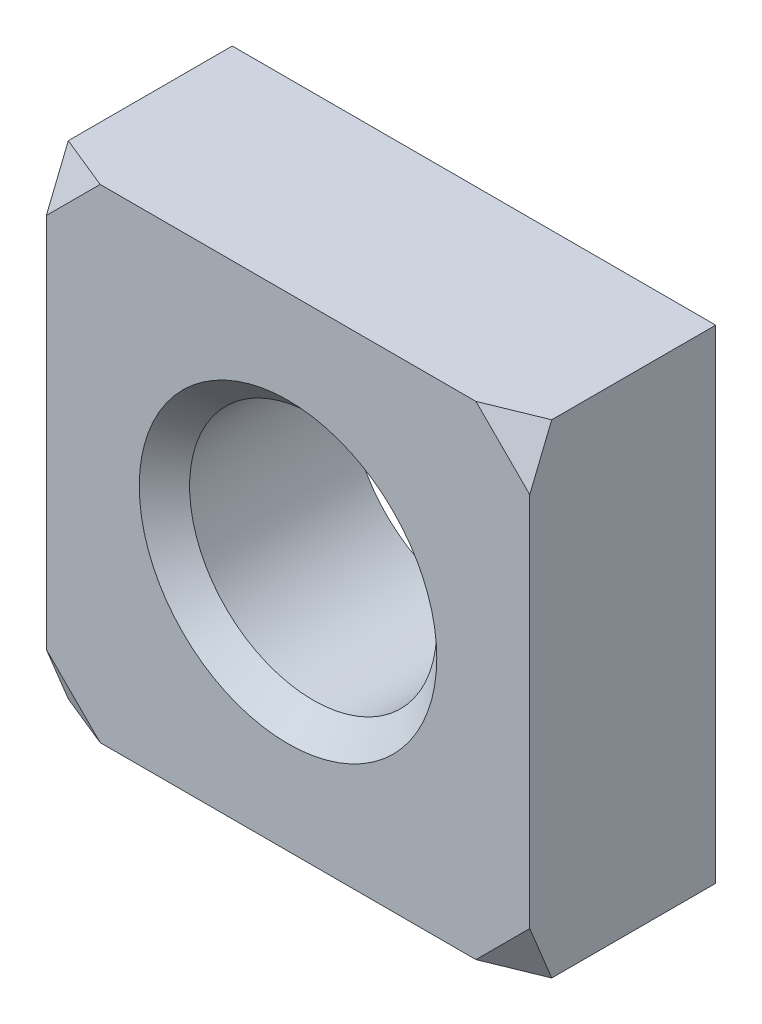
ISO-10303-21;
HEADER;
FILE_DESCRIPTION(('STEP AP214'),'2;1');
FILE_NAME('part.step','',(''),(''),'','','');
FILE_SCHEMA(('AUTOMOTIVE_DESIGN { 1 0 10303 214 1 1 1 1 }'));
ENDSEC;
DATA;
#1=APPLICATION_CONTEXT('core data for automotive mechanical design processes');
#2=APPLICATION_PROTOCOL_DEFINITION('international standard','automotive_design',2000,#1);
#3=PRODUCT_CONTEXT('',#1,'mechanical');
#4=PRODUCT('Part','Part','',(#3));
#5=PRODUCT_RELATED_PRODUCT_CATEGORY('part','',(#4));
#6=PRODUCT_DEFINITION_FORMATION('','',#4);
#7=PRODUCT_DEFINITION_CONTEXT('part definition',#1,'design');
#8=PRODUCT_DEFINITION('design','',#6,#7);
#9=PRODUCT_DEFINITION_SHAPE('','',#8);
#10=(LENGTH_UNIT() NAMED_UNIT(*) SI_UNIT(.MILLI.,.METRE.));
#11=(NAMED_UNIT(*) PLANE_ANGLE_UNIT() SI_UNIT($,.RADIAN.));
#12=(NAMED_UNIT(*) SI_UNIT($,.STERADIAN.) SOLID_ANGLE_UNIT());
#13=UNCERTAINTY_MEASURE_WITH_UNIT(LENGTH_MEASURE(1.E-05),#10,'distance_accuracy_value','');
#14=(GEOMETRIC_REPRESENTATION_CONTEXT(3) GLOBAL_UNCERTAINTY_ASSIGNED_CONTEXT((#13)) GLOBAL_UNIT_ASSIGNED_CONTEXT((#10,
#11,#12)) REPRESENTATION_CONTEXT('',''));
#15=CARTESIAN_POINT('',(0.,0.,0.));
#16=DIRECTION('',(0.,0.,1.));
#17=DIRECTION('',(1.,0.,0.));
#18=AXIS2_PLACEMENT_3D('',#15,#16,#17);
#19=CARTESIAN_POINT('',(0.,-6.5,3.25));
#20=DIRECTION('',(0.,-1.,0.));
#21=DIRECTION('',(1.,0.,0.));
#22=AXIS2_PLACEMENT_3D('',#19,#20,#21);
#23=PLANE('',#22);
#24=DIRECTION('',(-1.,0.,0.));
#25=VECTOR('',#24,1.);
#26=CARTESIAN_POINT('',(6.5,-6.5,1.5));
#27=LINE('',#26,#25);
#28=CARTESIAN_POINT('',(6.5,-6.5,1.5));
#29=VERTEX_POINT('',#28);
#30=CARTESIAN_POINT('',(-6.5,-6.5,1.5));
#31=VERTEX_POINT('',#30);
#32=EDGE_CURVE('E101',#29,#31,#27,.T.);
#33=ORIENTED_EDGE('',*,*,#32,.F.);
#34=DIRECTION('',(0.,0.,-1.));
#35=VECTOR('',#34,1.);
#36=CARTESIAN_POINT('',(6.5,-6.5,3.25));
#37=LINE('',#36,#35);
#38=CARTESIAN_POINT('',(6.5,-6.5,5.90909090909091));
#39=VERTEX_POINT('',#38);
#40=EDGE_CURVE('E111',#39,#29,#37,.T.);
#41=ORIENTED_EDGE('',*,*,#40,.F.);
#42=DIRECTION('',(0.925820099772552,0.,-0.377964473009227));
#43=VECTOR('',#42,1.);
#44=CARTESIAN_POINT('',(1.85905941527803,-6.5,7.80374696894802));
#45=LINE('',#44,#43);
#46=CARTESIAN_POINT('',(5.05257424290085,-6.5,6.5));
#47=VERTEX_POINT('',#46);
#48=EDGE_CURVE('E150',#47,#39,#45,.T.);
#49=ORIENTED_EDGE('',*,*,#48,.F.);
#50=DIRECTION('',(1.,0.,0.));
#51=VECTOR('',#50,1.);
#52=CARTESIAN_POINT('',(0.,-6.5,6.5));
#53=LINE('',#52,#51);
#54=CARTESIAN_POINT('',(-5.05257424290086,-6.5,6.5));
#55=VERTEX_POINT('',#54);
#56=EDGE_CURVE('E120',#55,#47,#53,.T.);
#57=ORIENTED_EDGE('',*,*,#56,.F.);
#58=DIRECTION('',(0.925820099772552,0.,0.377964473009227));
#59=VECTOR('',#58,1.);
#60=CARTESIAN_POINT('',(-1.85905941527803,-6.5,7.80374696894802));
#61=LINE('',#60,#59);
#62=CARTESIAN_POINT('',(-6.5,-6.5,5.90909090909091));
#63=VERTEX_POINT('',#62);
#64=EDGE_CURVE('E171',#63,#55,#61,.T.);
#65=ORIENTED_EDGE('',*,*,#64,.F.);
#66=DIRECTION('',(0.,0.,1.));
#67=VECTOR('',#66,1.);
#68=CARTESIAN_POINT('',(-6.5,-6.5,3.25));
#69=LINE('',#68,#67);
#70=EDGE_CURVE('E113',#31,#63,#69,.T.);
#71=ORIENTED_EDGE('',*,*,#70,.F.);
#72=EDGE_LOOP('',(#33,#41,#49,#57,#65,#71));
#73=FACE_BOUND('',#72,.T.);
#74=ADVANCED_FACE('F34',(#73),#23,.T.);
#75=CARTESIAN_POINT('',(-6.5,6.5,3.25));
#76=DIRECTION('',(-1.,0.,0.));
#77=DIRECTION('',(0.,-1.,0.));
#78=AXIS2_PLACEMENT_3D('',#75,#76,#77);
#79=PLANE('',#78);
#80=DIRECTION('',(0.,1.,0.));
#81=VECTOR('',#80,1.);
#82=CARTESIAN_POINT('',(-6.5,-6.5,1.5));
#83=LINE('',#82,#81);
#84=CARTESIAN_POINT('',(-6.5,6.5,1.5));
#85=VERTEX_POINT('',#84);
#86=EDGE_CURVE('E114',#31,#85,#83,.T.);
#87=ORIENTED_EDGE('',*,*,#86,.F.);
#88=ORIENTED_EDGE('',*,*,#70,.T.);
#89=DIRECTION('',(0.,-0.925820099772552,-0.377964473009227));
#90=VECTOR('',#89,1.);
#91=CARTESIAN_POINT('',(-6.5,3.71236915615055,10.0782731586752));
#92=LINE('',#91,#90);
#93=CARTESIAN_POINT('',(-6.5,-5.05257424290085,6.5));
#94=VERTEX_POINT('',#93);
#95=EDGE_CURVE('E161',#94,#63,#92,.T.);
#96=ORIENTED_EDGE('',*,*,#95,.F.);
#97=DIRECTION('',(0.,-1.,0.));
#98=VECTOR('',#97,1.);
#99=CARTESIAN_POINT('',(-6.5,6.5,6.5));
#100=LINE('',#99,#98);
#101=CARTESIAN_POINT('',(-6.5,5.05257424290085,6.5));
#102=VERTEX_POINT('',#101);
#103=EDGE_CURVE('E121',#102,#94,#100,.T.);
#104=ORIENTED_EDGE('',*,*,#103,.F.);
#105=DIRECTION('',(0.,-0.925820099772552,0.377964473009227));
#106=VECTOR('',#105,1.);
#107=CARTESIAN_POINT('',(-6.5,7.4304879867066,5.52922077922078));
#108=LINE('',#107,#106);
#109=CARTESIAN_POINT('',(-6.5,6.5,5.90909090909091));
#110=VERTEX_POINT('',#109);
#111=EDGE_CURVE('E177',#110,#102,#108,.T.);
#112=ORIENTED_EDGE('',*,*,#111,.F.);
#113=DIRECTION('',(0.,0.,-1.));
#114=VECTOR('',#113,1.);
#115=CARTESIAN_POINT('',(-6.5,6.5,3.25));
#116=LINE('',#115,#114);
#117=EDGE_CURVE('E180',#110,#85,#116,.T.);
#118=ORIENTED_EDGE('',*,*,#117,.T.);
#119=EDGE_LOOP('',(#87,#88,#96,#104,#112,#118));
#120=FACE_BOUND('',#119,.T.);
#121=ADVANCED_FACE('F212',(#120),#79,.T.);
#122=CARTESIAN_POINT('',(0.,6.5,6.5));
#123=DIRECTION('',(0.,0.,1.));
#124=DIRECTION('',(0.,-1.,0.));
#125=AXIS2_PLACEMENT_3D('',#122,#123,#124);
#126=PLANE('',#125);
#127=CARTESIAN_POINT('',(0.,0.,6.5));
#128=DIRECTION('',(0.,0.,-1.));
#129=DIRECTION('',(0.,1.,0.));
#130=AXIS2_PLACEMENT_3D('',#127,#128,#129);
#131=CIRCLE('',#130,4.);
#132=CARTESIAN_POINT('',(0.,4.,6.5));
#133=VERTEX_POINT('',#132);
#134=EDGE_CURVE('E202',#133,#133,#131,.T.);
#135=ORIENTED_EDGE('',*,*,#134,.T.);
#136=EDGE_LOOP('',(#135));
#137=FACE_BOUND('',#136,.T.);
#138=DIRECTION('',(0.707106781186547,-0.707106781186548,0.));
#139=VECTOR('',#138,1.);
#140=CARTESIAN_POINT('',(2.52628712145042,9.02628712145043,6.5));
#141=LINE('',#140,#139);
#142=CARTESIAN_POINT('',(5.05257424290085,6.5,6.5));
#143=VERTEX_POINT('',#142);
#144=CARTESIAN_POINT('',(6.5,5.05257424290085,6.5));
#145=VERTEX_POINT('',#144);
#146=EDGE_CURVE('E57',#143,#145,#141,.T.);
#147=ORIENTED_EDGE('',*,*,#146,.F.);
#148=DIRECTION('',(-1.,0.,0.));
#149=VECTOR('',#148,1.);
#150=CARTESIAN_POINT('',(0.,6.5,6.5));
#151=LINE('',#150,#149);
#152=CARTESIAN_POINT('',(-5.05257424290085,6.5,6.5));
#153=VERTEX_POINT('',#152);
#154=EDGE_CURVE('E184',#143,#153,#151,.T.);
#155=ORIENTED_EDGE('',*,*,#154,.T.);
#156=DIRECTION('',(0.707106781186548,0.707106781186548,0.));
#157=VECTOR('',#156,1.);
#158=CARTESIAN_POINT('',(-2.52628712145042,9.02628712145043,6.5));
#159=LINE('',#158,#157);
#160=EDGE_CURVE('E173',#102,#153,#159,.T.);
#161=ORIENTED_EDGE('',*,*,#160,.F.);
#162=ORIENTED_EDGE('',*,*,#103,.T.);
#163=DIRECTION('',(-0.707106781186548,0.707106781186548,0.));
#164=VECTOR('',#163,1.);
#165=CARTESIAN_POINT('',(-9.02628712145043,-2.52628712145042,6.5));
#166=LINE('',#165,#164);
#167=EDGE_CURVE('E140',#55,#94,#166,.T.);
#168=ORIENTED_EDGE('',*,*,#167,.F.);
#169=ORIENTED_EDGE('',*,*,#56,.T.);
#170=DIRECTION('',(-0.707106781186548,-0.707106781186547,0.));
#171=VECTOR('',#170,1.);
#172=CARTESIAN_POINT('',(9.02628712145043,-2.52628712145043,6.5));
#173=LINE('',#172,#171);
#174=CARTESIAN_POINT('',(6.5,-5.05257424290085,6.5));
#175=VERTEX_POINT('',#174);
#176=EDGE_CURVE('E149',#175,#47,#173,.T.);
#177=ORIENTED_EDGE('',*,*,#176,.F.);
#178=DIRECTION('',(0.,-1.,0.));
#179=VECTOR('',#178,1.);
#180=CARTESIAN_POINT('',(6.5,6.5,6.5));
#181=LINE('',#180,#179);
#182=EDGE_CURVE('E131',#145,#175,#181,.T.);
#183=ORIENTED_EDGE('',*,*,#182,.F.);
#184=EDGE_LOOP('',(#147,#155,#161,#162,#168,#169,#177,#183));
#185=FACE_BOUND('',#184,.T.);
#186=ADVANCED_FACE('F153',(#137,#185),#126,.T.);
#187=CARTESIAN_POINT('',(0.,6.5,3.25));
#188=DIRECTION('',(0.,1.,0.));
#189=DIRECTION('',(-1.,0.,0.));
#190=AXIS2_PLACEMENT_3D('',#187,#188,#189);
#191=PLANE('',#190);
#192=DIRECTION('',(1.,0.,0.));
#193=VECTOR('',#192,1.);
#194=CARTESIAN_POINT('',(6.5,6.5,1.5));
#195=LINE('',#194,#193);
#196=CARTESIAN_POINT('',(6.5,6.5,1.5));
#197=VERTEX_POINT('',#196);
#198=EDGE_CURVE('E50',#85,#197,#195,.T.);
#199=ORIENTED_EDGE('',*,*,#198,.F.);
#200=ORIENTED_EDGE('',*,*,#117,.F.);
#201=DIRECTION('',(-0.925820099772552,0.,-0.377964473009227));
#202=VECTOR('',#201,1.);
#203=CARTESIAN_POINT('',(-1.85905941527803,6.5,7.80374696894802));
#204=LINE('',#203,#202);
#205=EDGE_CURVE('E137',#153,#110,#204,.T.);
#206=ORIENTED_EDGE('',*,*,#205,.F.);
#207=ORIENTED_EDGE('',*,*,#154,.F.);
#208=DIRECTION('',(-0.925820099772551,0.,0.377964473009227));
#209=VECTOR('',#208,1.);
#210=CARTESIAN_POINT('',(1.85905941527803,6.5,7.80374696894802));
#211=LINE('',#210,#209);
#212=CARTESIAN_POINT('',(6.5,6.5,5.90909090909091));
#213=VERTEX_POINT('',#212);
#214=EDGE_CURVE('E164',#213,#143,#211,.T.);
#215=ORIENTED_EDGE('',*,*,#214,.F.);
#216=DIRECTION('',(0.,0.,1.));
#217=VECTOR('',#216,1.);
#218=CARTESIAN_POINT('',(6.5,6.5,3.25));
#219=LINE('',#218,#217);
#220=EDGE_CURVE('E181',#197,#213,#219,.T.);
#221=ORIENTED_EDGE('',*,*,#220,.F.);
#222=EDGE_LOOP('',(#199,#200,#206,#207,#215,#221));
#223=FACE_BOUND('',#222,.T.);
#224=ADVANCED_FACE('F195',(#223),#191,.T.);
#225=CARTESIAN_POINT('',(6.5,6.5,3.25));
#226=DIRECTION('',(1.,0.,0.));
#227=DIRECTION('',(0.,1.,0.));
#228=AXIS2_PLACEMENT_3D('',#225,#226,#227);
#229=PLANE('',#228);
#230=DIRECTION('',(0.,-1.,0.));
#231=VECTOR('',#230,1.);
#232=CARTESIAN_POINT('',(6.5,-6.5,1.5));
#233=LINE('',#232,#231);
#234=EDGE_CURVE('E97',#197,#29,#233,.T.);
#235=ORIENTED_EDGE('',*,*,#234,.F.);
#236=ORIENTED_EDGE('',*,*,#220,.T.);
#237=DIRECTION('',(0.,0.925820099772552,-0.377964473009227));
#238=VECTOR('',#237,1.);
#239=CARTESIAN_POINT('',(6.5,7.4304879867066,5.52922077922078));
#240=LINE('',#239,#238);
#241=EDGE_CURVE('E11',#145,#213,#240,.T.);
#242=ORIENTED_EDGE('',*,*,#241,.F.);
#243=ORIENTED_EDGE('',*,*,#182,.T.);
#244=DIRECTION('',(0.,0.925820099772551,0.377964473009227));
#245=VECTOR('',#244,1.);
#246=CARTESIAN_POINT('',(6.5,3.71236915615054,10.0782731586752));
#247=LINE('',#246,#245);
#248=EDGE_CURVE('E43',#39,#175,#247,.T.);
#249=ORIENTED_EDGE('',*,*,#248,.F.);
#250=ORIENTED_EDGE('',*,*,#40,.T.);
#251=EDGE_LOOP('',(#235,#236,#242,#243,#249,#250));
#252=FACE_BOUND('',#251,.T.);
#253=ADVANCED_FACE('F117',(#252),#229,.T.);
#254=CARTESIAN_POINT('',(-0.435417437700575,6.93541743770057,8.20718794794719));
#255=DIRECTION('',(0.353553390593274,-0.353553390593274,-0.866025403784439));
#256=DIRECTION('',(0.0669872981077806,0.933012701892219,-0.353553390593274));
#257=AXIS2_PLACEMENT_3D('',#254,#255,#256);
#258=PLANE('',#257);
#259=ORIENTED_EDGE('',*,*,#111,.T.);
#260=ORIENTED_EDGE('',*,*,#160,.T.);
#261=ORIENTED_EDGE('',*,*,#205,.T.);
#262=EDGE_LOOP('',(#259,#260,#261));
#263=FACE_BOUND('',#262,.T.);
#264=ADVANCED_FACE('F217',(#263),#258,.F.);
#265=CARTESIAN_POINT('',(-6.93541743770057,-0.435417437700574,8.20718794794719));
#266=DIRECTION('',(0.353553390593274,0.353553390593274,-0.866025403784439));
#267=DIRECTION('',(-0.933012701892219,0.0669872981077807,-0.353553390593274));
#268=AXIS2_PLACEMENT_3D('',#265,#266,#267);
#269=PLANE('',#268);
#270=ORIENTED_EDGE('',*,*,#64,.T.);
#271=ORIENTED_EDGE('',*,*,#167,.T.);
#272=ORIENTED_EDGE('',*,*,#95,.T.);
#273=EDGE_LOOP('',(#270,#271,#272));
#274=FACE_BOUND('',#273,.T.);
#275=ADVANCED_FACE('F219',(#274),#269,.F.);
#276=CARTESIAN_POINT('',(0.435417437700574,-6.93541743770057,8.20718794794719));
#277=DIRECTION('',(-0.353553390593274,0.353553390593274,-0.866025403784439));
#278=DIRECTION('',(-0.0669872981077807,-0.933012701892219,-0.353553390593274));
#279=AXIS2_PLACEMENT_3D('',#276,#277,#278);
#280=PLANE('',#279);
#281=ORIENTED_EDGE('',*,*,#48,.T.);
#282=ORIENTED_EDGE('',*,*,#248,.T.);
#283=ORIENTED_EDGE('',*,*,#176,.T.);
#284=EDGE_LOOP('',(#281,#282,#283));
#285=FACE_BOUND('',#284,.T.);
#286=ADVANCED_FACE('F148',(#285),#280,.F.);
#287=CARTESIAN_POINT('',(6.93541743770057,0.435417437700574,8.20718794794719));
#288=DIRECTION('',(-0.353553390593274,-0.353553390593274,-0.866025403784439));
#289=DIRECTION('',(0.933012701892219,-0.0669872981077808,-0.353553390593274));
#290=AXIS2_PLACEMENT_3D('',#287,#288,#289);
#291=PLANE('',#290);
#292=ORIENTED_EDGE('',*,*,#146,.T.);
#293=ORIENTED_EDGE('',*,*,#241,.T.);
#294=ORIENTED_EDGE('',*,*,#214,.T.);
#295=EDGE_LOOP('',(#292,#293,#294));
#296=FACE_BOUND('',#295,.T.);
#297=ADVANCED_FACE('F192',(#296),#291,.F.);
#298=CARTESIAN_POINT('',(0.,0.,0.));
#299=DIRECTION('',(0.,0.,-1.));
#300=DIRECTION('',(0.,1.,0.));
#301=AXIS2_PLACEMENT_3D('',#298,#299,#300);
#302=CYLINDRICAL_SURFACE('',#301,3.3234375);
#303=CARTESIAN_POINT('',(0.,0.,1.5));
#304=DIRECTION('',(0.,0.,1.));
#305=DIRECTION('',(0.,-1.,0.));
#306=AXIS2_PLACEMENT_3D('',#303,#304,#305);
#307=CIRCLE('',#306,3.3234375);
#308=CARTESIAN_POINT('',(0.,-3.3234375,1.5));
#309=VERTEX_POINT('',#308);
#310=EDGE_CURVE('E37',#309,#309,#307,.F.);
#311=ORIENTED_EDGE('',*,*,#310,.T.);
#312=EDGE_LOOP('',(#311));
#313=FACE_BOUND('',#312,.T.);
#314=CARTESIAN_POINT('',(0.,0.,5.8234375));
#315=DIRECTION('',(0.,0.,-1.));
#316=DIRECTION('',(0.,1.,0.));
#317=AXIS2_PLACEMENT_3D('',#314,#315,#316);
#318=CIRCLE('',#317,3.3234375);
#319=CARTESIAN_POINT('',(0.,3.3234375,5.8234375));
#320=VERTEX_POINT('',#319);
#321=EDGE_CURVE('E198',#320,#320,#318,.T.);
#322=ORIENTED_EDGE('',*,*,#321,.F.);
#323=EDGE_LOOP('',(#322));
#324=FACE_BOUND('',#323,.T.);
#325=ADVANCED_FACE('F301',(#313,#324),#302,.F.);
#326=CARTESIAN_POINT('',(0.,0.,5.8234375));
#327=DIRECTION('',(0.,0.,1.));
#328=DIRECTION('',(0.,-1.,0.));
#329=AXIS2_PLACEMENT_3D('',#326,#327,#328);
#330=CONICAL_SURFACE('',#329,3.3234375,0.785398163397449);
#331=ORIENTED_EDGE('',*,*,#134,.F.);
#332=EDGE_LOOP('',(#331));
#333=FACE_BOUND('',#332,.T.);
#334=ORIENTED_EDGE('',*,*,#321,.T.);
#335=EDGE_LOOP('',(#334));
#336=FACE_BOUND('',#335,.T.);
#337=ADVANCED_FACE('F310',(#333,#336),#330,.F.);
#338=CARTESIAN_POINT('',(0.,0.,1.5));
#339=DIRECTION('',(0.,0.,1.));
#340=DIRECTION('',(0.,-1.,0.));
#341=AXIS2_PLACEMENT_3D('',#338,#339,#340);
#342=PLANE('',#341);
#343=ORIENTED_EDGE('',*,*,#234,.T.);
#344=ORIENTED_EDGE('',*,*,#32,.T.);
#345=ORIENTED_EDGE('',*,*,#86,.T.);
#346=ORIENTED_EDGE('',*,*,#198,.T.);
#347=EDGE_LOOP('',(#343,#344,#345,#346));
#348=FACE_BOUND('',#347,.T.);
#349=ORIENTED_EDGE('',*,*,#310,.F.);
#350=EDGE_LOOP('',(#349));
#351=FACE_BOUND('',#350,.T.);
#352=ADVANCED_FACE('F99',(#348,#351),#342,.F.);
#353=CLOSED_SHELL('',(#74,#121,#186,#224,#253,#264,#275,#286,#297,#325,#337,#352));
#354=MANIFOLD_SOLID_BREP('B2',#353);
#355=ADVANCED_BREP_SHAPE_REPRESENTATION('',(#18,#354),#14);
#356=SHAPE_DEFINITION_REPRESENTATION(#9,#355);
ENDSEC;
END-ISO-10303-21;
